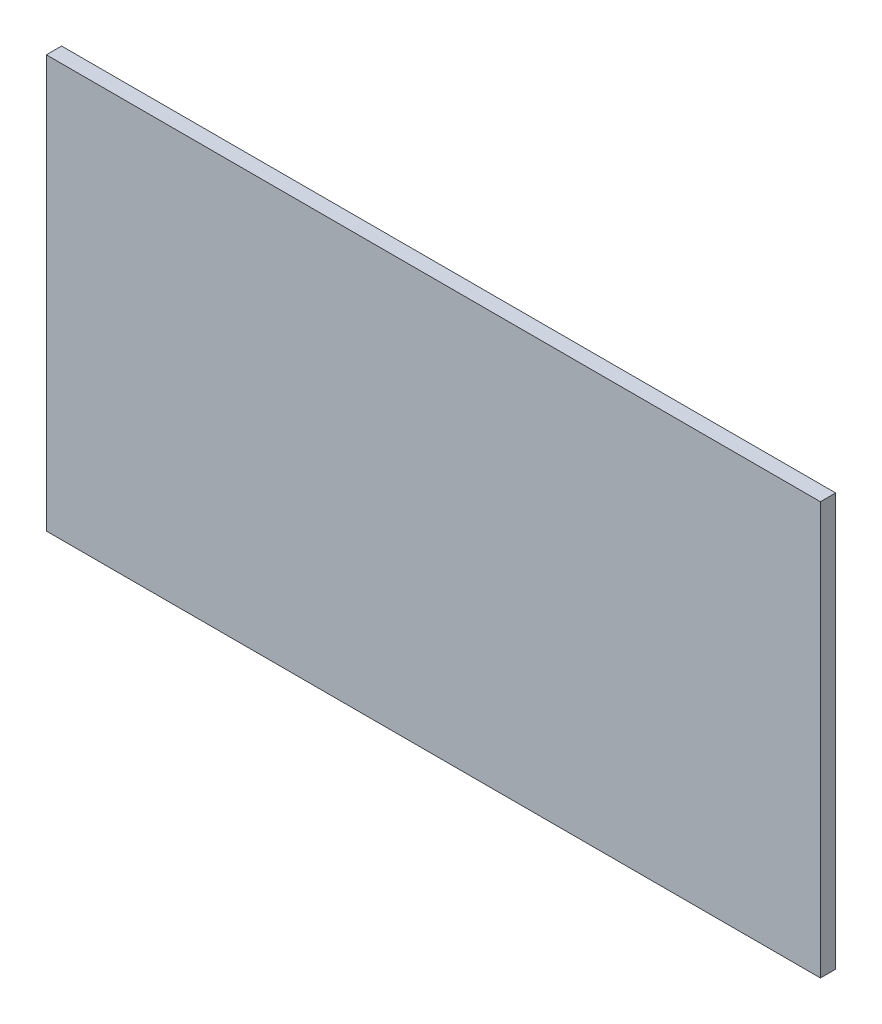
ISO-10303-21;
HEADER;
FILE_DESCRIPTION(('STEP AP214'),'2;1');
FILE_NAME('part.step','',(''),(''),'','','');
FILE_SCHEMA(('AUTOMOTIVE_DESIGN { 1 0 10303 214 1 1 1 1 }'));
ENDSEC;
DATA;
#1=APPLICATION_CONTEXT('core data for automotive mechanical design processes');
#2=APPLICATION_PROTOCOL_DEFINITION('international standard','automotive_design',2000,#1);
#3=PRODUCT_CONTEXT('',#1,'mechanical');
#4=PRODUCT('Part','Part','',(#3));
#5=PRODUCT_RELATED_PRODUCT_CATEGORY('part','',(#4));
#6=PRODUCT_DEFINITION_FORMATION('','',#4);
#7=PRODUCT_DEFINITION_CONTEXT('part definition',#1,'design');
#8=PRODUCT_DEFINITION('design','',#6,#7);
#9=PRODUCT_DEFINITION_SHAPE('','',#8);
#10=(LENGTH_UNIT() NAMED_UNIT(*) SI_UNIT(.MILLI.,.METRE.));
#11=(NAMED_UNIT(*) PLANE_ANGLE_UNIT() SI_UNIT($,.RADIAN.));
#12=(NAMED_UNIT(*) SI_UNIT($,.STERADIAN.) SOLID_ANGLE_UNIT());
#13=UNCERTAINTY_MEASURE_WITH_UNIT(LENGTH_MEASURE(1.E-05),#10,'distance_accuracy_value','');
#14=(GEOMETRIC_REPRESENTATION_CONTEXT(3) GLOBAL_UNCERTAINTY_ASSIGNED_CONTEXT((#13)) GLOBAL_UNIT_ASSIGNED_CONTEXT((#10,
#11,#12)) REPRESENTATION_CONTEXT('',''));
#15=CARTESIAN_POINT('',(0.,0.,0.));
#16=DIRECTION('',(0.,0.,1.));
#17=DIRECTION('',(1.,0.,0.));
#18=AXIS2_PLACEMENT_3D('',#15,#16,#17);
#19=CARTESIAN_POINT('',(-152.4,-81.2,6.));
#20=DIRECTION('',(1.,0.,0.));
#21=DIRECTION('',(0.,0.,-1.));
#22=AXIS2_PLACEMENT_3D('',#19,#20,#21);
#23=PLANE('',#22);
#24=DIRECTION('',(0.,-1.,0.));
#25=VECTOR('',#24,1.);
#26=CARTESIAN_POINT('',(-152.4,-81.2,0.));
#27=LINE('',#26,#25);
#28=CARTESIAN_POINT('',(-152.4,81.2,0.));
#29=VERTEX_POINT('',#28);
#30=CARTESIAN_POINT('',(-152.4,-81.2,0.));
#31=VERTEX_POINT('',#30);
#32=EDGE_CURVE('E96',#29,#31,#27,.T.);
#33=ORIENTED_EDGE('',*,*,#32,.T.);
#34=DIRECTION('',(0.,0.,-1.));
#35=VECTOR('',#34,1.);
#36=CARTESIAN_POINT('',(-152.4,-81.2,6.));
#37=LINE('',#36,#35);
#38=CARTESIAN_POINT('',(-152.4,-81.2,6.));
#39=VERTEX_POINT('',#38);
#40=EDGE_CURVE('E11',#39,#31,#37,.T.);
#41=ORIENTED_EDGE('',*,*,#40,.F.);
#42=DIRECTION('',(0.,-1.,0.));
#43=VECTOR('',#42,1.);
#44=CARTESIAN_POINT('',(-152.4,-81.2,6.));
#45=LINE('',#44,#43);
#46=CARTESIAN_POINT('',(-152.4,81.2,6.));
#47=VERTEX_POINT('',#46);
#48=EDGE_CURVE('E84',#47,#39,#45,.T.);
#49=ORIENTED_EDGE('',*,*,#48,.F.);
#50=DIRECTION('',(0.,0.,-1.));
#51=VECTOR('',#50,1.);
#52=CARTESIAN_POINT('',(-152.4,81.2,6.));
#53=LINE('',#52,#51);
#54=EDGE_CURVE('E92',#47,#29,#53,.T.);
#55=ORIENTED_EDGE('',*,*,#54,.T.);
#56=EDGE_LOOP('',(#33,#41,#49,#55));
#57=FACE_BOUND('',#56,.T.);
#58=ADVANCED_FACE('F33',(#57),#23,.F.);
#59=CARTESIAN_POINT('',(152.4,-81.2,6.));
#60=DIRECTION('',(0.,1.,0.));
#61=DIRECTION('',(-1.,0.,0.));
#62=AXIS2_PLACEMENT_3D('',#59,#60,#61);
#63=PLANE('',#62);
#64=DIRECTION('',(1.,0.,0.));
#65=VECTOR('',#64,1.);
#66=CARTESIAN_POINT('',(152.4,-81.2,0.));
#67=LINE('',#66,#65);
#68=CARTESIAN_POINT('',(152.4,-81.2,0.));
#69=VERTEX_POINT('',#68);
#70=EDGE_CURVE('E88',#31,#69,#67,.T.);
#71=ORIENTED_EDGE('',*,*,#70,.T.);
#72=DIRECTION('',(0.,0.,-1.));
#73=VECTOR('',#72,1.);
#74=CARTESIAN_POINT('',(152.4,-81.2,6.));
#75=LINE('',#74,#73);
#76=CARTESIAN_POINT('',(152.4,-81.2,6.));
#77=VERTEX_POINT('',#76);
#78=EDGE_CURVE('E41',#77,#69,#75,.T.);
#79=ORIENTED_EDGE('',*,*,#78,.F.);
#80=DIRECTION('',(1.,0.,0.));
#81=VECTOR('',#80,1.);
#82=CARTESIAN_POINT('',(152.4,-81.2,6.));
#83=LINE('',#82,#81);
#84=EDGE_CURVE('E79',#39,#77,#83,.T.);
#85=ORIENTED_EDGE('',*,*,#84,.F.);
#86=ORIENTED_EDGE('',*,*,#40,.T.);
#87=EDGE_LOOP('',(#71,#79,#85,#86));
#88=FACE_BOUND('',#87,.T.);
#89=ADVANCED_FACE('F87',(#88),#63,.F.);
#90=CARTESIAN_POINT('',(152.4,-81.2,6.));
#91=DIRECTION('',(-1.,0.,0.));
#92=DIRECTION('',(0.,0.,1.));
#93=AXIS2_PLACEMENT_3D('',#90,#91,#92);
#94=PLANE('',#93);
#95=DIRECTION('',(0.,1.,0.));
#96=VECTOR('',#95,1.);
#97=CARTESIAN_POINT('',(152.4,-81.2,0.));
#98=LINE('',#97,#96);
#99=CARTESIAN_POINT('',(152.4,81.2,0.));
#100=VERTEX_POINT('',#99);
#101=EDGE_CURVE('E66',#69,#100,#98,.T.);
#102=ORIENTED_EDGE('',*,*,#101,.T.);
#103=DIRECTION('',(0.,0.,-1.));
#104=VECTOR('',#103,1.);
#105=CARTESIAN_POINT('',(152.4,81.2,6.));
#106=LINE('',#105,#104);
#107=CARTESIAN_POINT('',(152.4,81.2,6.));
#108=VERTEX_POINT('',#107);
#109=EDGE_CURVE('E89',#108,#100,#106,.T.);
#110=ORIENTED_EDGE('',*,*,#109,.F.);
#111=DIRECTION('',(0.,1.,0.));
#112=VECTOR('',#111,1.);
#113=CARTESIAN_POINT('',(152.4,-81.2,6.));
#114=LINE('',#113,#112);
#115=EDGE_CURVE('E82',#77,#108,#114,.T.);
#116=ORIENTED_EDGE('',*,*,#115,.F.);
#117=ORIENTED_EDGE('',*,*,#78,.T.);
#118=EDGE_LOOP('',(#102,#110,#116,#117));
#119=FACE_BOUND('',#118,.T.);
#120=ADVANCED_FACE('F90',(#119),#94,.F.);
#121=CARTESIAN_POINT('',(152.4,81.2,6.));
#122=DIRECTION('',(0.,-1.,0.));
#123=DIRECTION('',(1.,0.,0.));
#124=AXIS2_PLACEMENT_3D('',#121,#122,#123);
#125=PLANE('',#124);
#126=DIRECTION('',(-1.,0.,0.));
#127=VECTOR('',#126,1.);
#128=CARTESIAN_POINT('',(152.4,81.2,0.));
#129=LINE('',#128,#127);
#130=EDGE_CURVE('E72',#100,#29,#129,.T.);
#131=ORIENTED_EDGE('',*,*,#130,.T.);
#132=ORIENTED_EDGE('',*,*,#54,.F.);
#133=DIRECTION('',(-1.,0.,0.));
#134=VECTOR('',#133,1.);
#135=CARTESIAN_POINT('',(152.4,81.2,6.));
#136=LINE('',#135,#134);
#137=EDGE_CURVE('E49',#108,#47,#136,.T.);
#138=ORIENTED_EDGE('',*,*,#137,.F.);
#139=ORIENTED_EDGE('',*,*,#109,.T.);
#140=EDGE_LOOP('',(#131,#132,#138,#139));
#141=FACE_BOUND('',#140,.T.);
#142=ADVANCED_FACE('F103',(#141),#125,.F.);
#143=CARTESIAN_POINT('',(0.,0.,6.));
#144=DIRECTION('',(0.,0.,1.));
#145=DIRECTION('',(1.,0.,0.));
#146=AXIS2_PLACEMENT_3D('',#143,#144,#145);
#147=PLANE('',#146);
#148=ORIENTED_EDGE('',*,*,#48,.T.);
#149=ORIENTED_EDGE('',*,*,#84,.T.);
#150=ORIENTED_EDGE('',*,*,#115,.T.);
#151=ORIENTED_EDGE('',*,*,#137,.T.);
#152=EDGE_LOOP('',(#148,#149,#150,#151));
#153=FACE_BOUND('',#152,.T.);
#154=ADVANCED_FACE('F80',(#153),#147,.T.);
#155=CARTESIAN_POINT('',(0.,0.,0.));
#156=DIRECTION('',(0.,0.,1.));
#157=DIRECTION('',(1.,0.,0.));
#158=AXIS2_PLACEMENT_3D('',#155,#156,#157);
#159=PLANE('',#158);
#160=ORIENTED_EDGE('',*,*,#32,.F.);
#161=ORIENTED_EDGE('',*,*,#130,.F.);
#162=ORIENTED_EDGE('',*,*,#101,.F.);
#163=ORIENTED_EDGE('',*,*,#70,.F.);
#164=EDGE_LOOP('',(#160,#161,#162,#163));
#165=FACE_BOUND('',#164,.T.);
#166=ADVANCED_FACE('F106',(#165),#159,.F.);
#167=CLOSED_SHELL('',(#58,#89,#120,#142,#154,#166));
#168=MANIFOLD_SOLID_BREP('B2',#167);
#169=ADVANCED_BREP_SHAPE_REPRESENTATION('',(#18,#168),#14);
#170=SHAPE_DEFINITION_REPRESENTATION(#9,#169);
ENDSEC;
END-ISO-10303-21;
